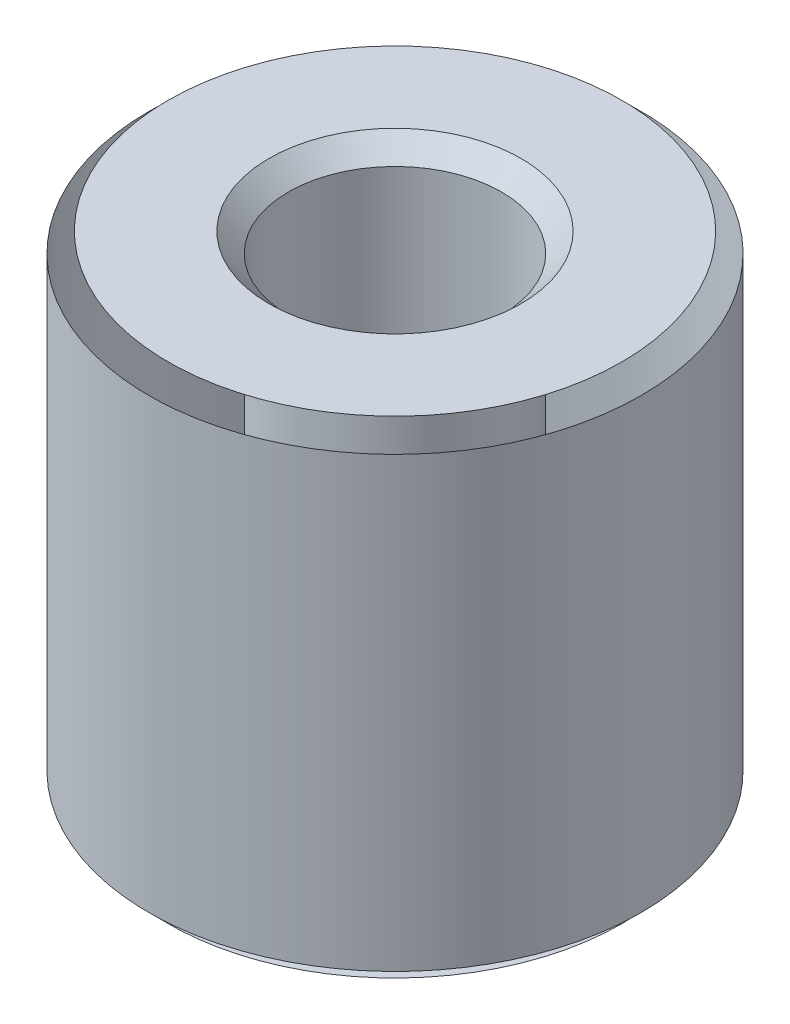
ISO-10303-21;
HEADER;
FILE_DESCRIPTION(('STEP AP214'),'2;1');
FILE_NAME('part.step','',(''),(''),'','','');
FILE_SCHEMA(('AUTOMOTIVE_DESIGN { 1 0 10303 214 1 1 1 1 }'));
ENDSEC;
DATA;
#1=APPLICATION_CONTEXT('core data for automotive mechanical design processes');
#2=APPLICATION_PROTOCOL_DEFINITION('international standard','automotive_design',2000,#1);
#3=PRODUCT_CONTEXT('',#1,'mechanical');
#4=PRODUCT('Part','Part','',(#3));
#5=PRODUCT_RELATED_PRODUCT_CATEGORY('part','',(#4));
#6=PRODUCT_DEFINITION_FORMATION('','',#4);
#7=PRODUCT_DEFINITION_CONTEXT('part definition',#1,'design');
#8=PRODUCT_DEFINITION('design','',#6,#7);
#9=PRODUCT_DEFINITION_SHAPE('','',#8);
#10=(LENGTH_UNIT() NAMED_UNIT(*) SI_UNIT(.MILLI.,.METRE.));
#11=(NAMED_UNIT(*) PLANE_ANGLE_UNIT() SI_UNIT($,.RADIAN.));
#12=(NAMED_UNIT(*) SI_UNIT($,.STERADIAN.) SOLID_ANGLE_UNIT());
#13=UNCERTAINTY_MEASURE_WITH_UNIT(LENGTH_MEASURE(1.E-05),#10,'distance_accuracy_value','');
#14=(GEOMETRIC_REPRESENTATION_CONTEXT(3) GLOBAL_UNCERTAINTY_ASSIGNED_CONTEXT((#13)) GLOBAL_UNIT_ASSIGNED_CONTEXT((#10,
#11,#12)) REPRESENTATION_CONTEXT('',''));
#15=CARTESIAN_POINT('',(0.,0.,0.));
#16=DIRECTION('',(0.,0.,1.));
#17=DIRECTION('',(1.,0.,0.));
#18=AXIS2_PLACEMENT_3D('',#15,#16,#17);
#19=CARTESIAN_POINT('',(19.4709999999783,-0.498499977939196,37.1094));
#20=DIRECTION('',(0.,-1.,0.));
#21=DIRECTION('',(-0.11186091417947,0.,0.99372387305475));
#22=AXIS2_PLACEMENT_3D('',#19,#20,#21);
#23=CONICAL_SURFACE('',#22,6.1,0.785398163397451);
#24=CARTESIAN_POINT('',(19.4709999999783,-0.748499977939197,37.1094));
#25=DIRECTION('',(0.,1.,0.));
#26=DIRECTION('',(-0.11186091417947,0.,0.99372387305475));
#27=AXIS2_PLACEMENT_3D('',#24,#25,#26);
#28=CIRCLE('',#27,6.35);
#29=CARTESIAN_POINT('',(20.1813168050179,-0.748499977939197,30.7992534061022));
#30=VERTEX_POINT('',#29);
#31=CARTESIAN_POINT('',(18.7606831949386,-0.748499977939197,43.4195465938976));
#32=VERTEX_POINT('',#31);
#33=EDGE_CURVE('E120',#30,#32,#28,.T.);
#34=ORIENTED_EDGE('',*,*,#33,.T.);
#35=CARTESIAN_POINT('',(19.4709999999783,-0.748499977939197,37.1094));
#36=DIRECTION('',(0.,1.,0.));
#37=DIRECTION('',(-0.11186091417947,0.,0.99372387305475));
#38=AXIS2_PLACEMENT_3D('',#35,#36,#37);
#39=CIRCLE('',#38,6.35);
#40=EDGE_CURVE('E28',#32,#30,#39,.T.);
#41=ORIENTED_EDGE('',*,*,#40,.T.);
#42=DIRECTION('',(-0.0790976109660302,0.707106781186545,0.702668889263976));
#43=VECTOR('',#42,1.);
#44=CARTESIAN_POINT('',(20.153351576473,-0.498499977939196,31.0476843743659));
#45=LINE('',#44,#43);
#46=CARTESIAN_POINT('',(20.1253863479282,-0.248499977939196,31.2961153426296));
#47=VERTEX_POINT('',#46);
#48=EDGE_CURVE('E11',#30,#47,#45,.T.);
#49=ORIENTED_EDGE('',*,*,#48,.T.);
#50=CARTESIAN_POINT('',(19.4709999999783,-0.248499977939196,37.1094));
#51=DIRECTION('',(0.,-1.,0.));
#52=DIRECTION('',(-0.11186091417947,0.,0.99372387305475));
#53=AXIS2_PLACEMENT_3D('',#50,#51,#52);
#54=CIRCLE('',#53,5.85);
#55=EDGE_CURVE('E129',#47,#47,#54,.T.);
#56=ORIENTED_EDGE('',*,*,#55,.T.);
#57=ORIENTED_EDGE('',*,*,#48,.F.);
#58=EDGE_LOOP('',(#34,#41,#49,#56,#57));
#59=FACE_BOUND('',#58,.T.);
#60=ADVANCED_FACE('F17',(#59),#23,.T.);
#61=CARTESIAN_POINT('',(19.4709999999783,-6.52499999999985,37.1094));
#62=DIRECTION('',(0.,-1.,0.));
#63=DIRECTION('',(0.11186091417947,0.,-0.99372387305475));
#64=AXIS2_PLACEMENT_3D('',#61,#62,#63);
#65=CYLINDRICAL_SURFACE('',#64,6.35);
#66=CARTESIAN_POINT('',(19.4709999999783,-12.3015000220605,37.1094));
#67=DIRECTION('',(0.,-1.,0.));
#68=DIRECTION('',(-0.11186091417947,0.,0.99372387305475));
#69=AXIS2_PLACEMENT_3D('',#66,#67,#68);
#70=CIRCLE('',#69,6.35);
#71=CARTESIAN_POINT('',(20.1813168050179,-12.3015000220605,30.7992534061022));
#72=VERTEX_POINT('',#71);
#73=CARTESIAN_POINT('',(18.7606831949386,-12.3015000220605,43.4195465938976));
#74=VERTEX_POINT('',#73);
#75=EDGE_CURVE('E124',#72,#74,#70,.T.);
#76=ORIENTED_EDGE('',*,*,#75,.F.);
#77=CARTESIAN_POINT('',(19.4709999999783,-12.3015000220605,37.1094));
#78=DIRECTION('',(0.,-1.,0.));
#79=DIRECTION('',(-0.11186091417947,0.,0.99372387305475));
#80=AXIS2_PLACEMENT_3D('',#77,#78,#79);
#81=CIRCLE('',#80,6.35);
#82=EDGE_CURVE('E121',#74,#72,#81,.T.);
#83=ORIENTED_EDGE('',*,*,#82,.F.);
#84=DIRECTION('',(0.,1.,0.));
#85=VECTOR('',#84,1.);
#86=CARTESIAN_POINT('',(18.7606831949386,-6.52499999999985,43.4195465938976));
#87=LINE('',#86,#85);
#88=EDGE_CURVE('E116',#74,#32,#87,.T.);
#89=ORIENTED_EDGE('',*,*,#88,.T.);
#90=ORIENTED_EDGE('',*,*,#33,.F.);
#91=ORIENTED_EDGE('',*,*,#40,.F.);
#92=ORIENTED_EDGE('',*,*,#88,.F.);
#93=EDGE_LOOP('',(#76,#83,#89,#90,#91,#92));
#94=FACE_BOUND('',#93,.T.);
#95=ADVANCED_FACE('F154',(#94),#65,.T.);
#96=CARTESIAN_POINT('',(19.4709999999783,-12.5515000220605,37.1094));
#97=DIRECTION('',(0.,1.,0.));
#98=DIRECTION('',(-0.11186091417947,0.,0.99372387305475));
#99=AXIS2_PLACEMENT_3D('',#96,#97,#98);
#100=CONICAL_SURFACE('',#99,6.1,0.785398163397454);
#101=CARTESIAN_POINT('',(19.4709999999783,-12.8015000220605,37.1094));
#102=DIRECTION('',(0.,1.,0.));
#103=DIRECTION('',(-0.11186091417947,0.,0.99372387305475));
#104=AXIS2_PLACEMENT_3D('',#101,#102,#103);
#105=CIRCLE('',#104,5.85);
#106=CARTESIAN_POINT('',(20.1253863479282,-12.8015000220605,31.2961153426296));
#107=VERTEX_POINT('',#106);
#108=EDGE_CURVE('E99',#107,#107,#105,.T.);
#109=ORIENTED_EDGE('',*,*,#108,.T.);
#110=DIRECTION('',(0.0790976109660304,0.707106781186544,-0.702668889263977));
#111=VECTOR('',#110,1.);
#112=CARTESIAN_POINT('',(20.153351576473,-12.5515000220605,31.0476843743659));
#113=LINE('',#112,#111);
#114=EDGE_CURVE('E74',#107,#72,#113,.T.);
#115=ORIENTED_EDGE('',*,*,#114,.T.);
#116=ORIENTED_EDGE('',*,*,#75,.T.);
#117=ORIENTED_EDGE('',*,*,#82,.T.);
#118=ORIENTED_EDGE('',*,*,#114,.F.);
#119=EDGE_LOOP('',(#109,#115,#116,#117,#118));
#120=FACE_BOUND('',#119,.T.);
#121=ADVANCED_FACE('F158',(#120),#100,.T.);
#122=CARTESIAN_POINT('',(20.1813168050179,-0.248499977939196,30.7992534061022));
#123=DIRECTION('',(0.,1.,0.));
#124=DIRECTION('',(1.,0.,0.));
#125=AXIS2_PLACEMENT_3D('',#122,#123,#124);
#126=PLANE('',#125);
#127=CARTESIAN_POINT('',(19.4709999999783,-0.248499977939196,37.1094));
#128=DIRECTION('',(0.,1.,0.));
#129=DIRECTION('',(0.,0.,-1.));
#130=AXIS2_PLACEMENT_3D('',#127,#128,#129);
#131=CIRCLE('',#130,3.25);
#132=CARTESIAN_POINT('',(19.4709999999783,-0.248499977939196,40.3594));
#133=VERTEX_POINT('',#132);
#134=EDGE_CURVE('E136',#133,#133,#131,.T.);
#135=ORIENTED_EDGE('',*,*,#134,.F.);
#136=EDGE_LOOP('',(#135));
#137=FACE_BOUND('',#136,.T.);
#138=ORIENTED_EDGE('',*,*,#55,.F.);
#139=EDGE_LOOP('',(#138));
#140=FACE_BOUND('',#139,.T.);
#141=ADVANCED_FACE('F213',(#137,#140),#126,.T.);
#142=CARTESIAN_POINT('',(19.4709999999783,-0.498499977939196,37.1094));
#143=DIRECTION('',(0.,1.,0.));
#144=DIRECTION('',(0.,0.,-1.));
#145=AXIS2_PLACEMENT_3D('',#142,#143,#144);
#146=CONICAL_SURFACE('',#145,3.,0.785398163397446);
#147=ORIENTED_EDGE('',*,*,#134,.T.);
#148=DIRECTION('',(0.,-0.707106781186549,-0.707106781186546));
#149=VECTOR('',#148,1.);
#150=CARTESIAN_POINT('',(19.4709999999783,-0.498499977939196,40.1094));
#151=LINE('',#150,#149);
#152=CARTESIAN_POINT('',(19.4709999999783,-0.748499977939197,39.8594));
#153=VERTEX_POINT('',#152);
#154=EDGE_CURVE('E63',#133,#153,#151,.T.);
#155=ORIENTED_EDGE('',*,*,#154,.T.);
#156=CARTESIAN_POINT('',(19.4709999999783,-0.748499977939197,37.1094));
#157=DIRECTION('',(0.,-1.,0.));
#158=DIRECTION('',(0.,0.,-1.));
#159=AXIS2_PLACEMENT_3D('',#156,#157,#158);
#160=CIRCLE('',#159,2.75);
#161=CARTESIAN_POINT('',(19.4709999999783,-0.748499977939197,34.3594));
#162=VERTEX_POINT('',#161);
#163=EDGE_CURVE('E105',#153,#162,#160,.T.);
#164=ORIENTED_EDGE('',*,*,#163,.T.);
#165=CARTESIAN_POINT('',(19.4709999999783,-0.748499977939197,37.1094));
#166=DIRECTION('',(0.,-1.,0.));
#167=DIRECTION('',(0.,0.,-1.));
#168=AXIS2_PLACEMENT_3D('',#165,#166,#167);
#169=CIRCLE('',#168,2.75);
#170=EDGE_CURVE('E96',#162,#153,#169,.T.);
#171=ORIENTED_EDGE('',*,*,#170,.T.);
#172=ORIENTED_EDGE('',*,*,#154,.F.);
#173=EDGE_LOOP('',(#147,#155,#164,#171,#172));
#174=FACE_BOUND('',#173,.T.);
#175=ADVANCED_FACE('F208',(#174),#146,.F.);
#176=CARTESIAN_POINT('',(19.4709999999783,-12.8015000220605,37.1094));
#177=DIRECTION('',(0.,-1.,0.));
#178=DIRECTION('',(0.,0.,-1.));
#179=AXIS2_PLACEMENT_3D('',#176,#177,#178);
#180=PLANE('',#179);
#181=CARTESIAN_POINT('',(19.4709999999783,-12.8015000220605,37.1094));
#182=DIRECTION('',(0.,-1.,0.));
#183=DIRECTION('',(0.,0.,1.));
#184=AXIS2_PLACEMENT_3D('',#181,#182,#183);
#185=CIRCLE('',#184,3.25);
#186=CARTESIAN_POINT('',(19.4709999999783,-12.8015000220605,33.8594));
#187=VERTEX_POINT('',#186);
#188=EDGE_CURVE('E113',#187,#187,#185,.T.);
#189=ORIENTED_EDGE('',*,*,#188,.F.);
#190=EDGE_LOOP('',(#189));
#191=FACE_BOUND('',#190,.T.);
#192=ORIENTED_EDGE('',*,*,#108,.F.);
#193=EDGE_LOOP('',(#192));
#194=FACE_BOUND('',#193,.T.);
#195=ADVANCED_FACE('F19',(#191,#194),#180,.T.);
#196=CARTESIAN_POINT('',(19.4709999999783,-7.15265000220592,37.1094));
#197=DIRECTION('',(0.,-1.,0.));
#198=DIRECTION('',(0.,0.,1.));
#199=AXIS2_PLACEMENT_3D('',#196,#197,#198);
#200=CYLINDRICAL_SURFACE('',#199,2.75);
#201=ORIENTED_EDGE('',*,*,#163,.F.);
#202=ORIENTED_EDGE('',*,*,#170,.F.);
#203=DIRECTION('',(0.,-1.,0.));
#204=VECTOR('',#203,1.);
#205=CARTESIAN_POINT('',(19.4709999999783,-7.15265000220592,34.3594));
#206=LINE('',#205,#204);
#207=CARTESIAN_POINT('',(19.4709999999783,-12.3015000220605,34.3594));
#208=VERTEX_POINT('',#207);
#209=EDGE_CURVE('E85',#162,#208,#206,.T.);
#210=ORIENTED_EDGE('',*,*,#209,.T.);
#211=CARTESIAN_POINT('',(19.4709999999783,-12.3015000220605,37.1094));
#212=DIRECTION('',(0.,1.,0.));
#213=DIRECTION('',(0.,0.,1.));
#214=AXIS2_PLACEMENT_3D('',#211,#212,#213);
#215=CIRCLE('',#214,2.75);
#216=EDGE_CURVE('E94',#208,#208,#215,.T.);
#217=ORIENTED_EDGE('',*,*,#216,.F.);
#218=ORIENTED_EDGE('',*,*,#209,.F.);
#219=EDGE_LOOP('',(#201,#202,#210,#217,#218));
#220=FACE_BOUND('',#219,.T.);
#221=ADVANCED_FACE('F93',(#220),#200,.F.);
#222=CARTESIAN_POINT('',(19.4709999999783,-12.5515000220605,37.1094));
#223=DIRECTION('',(0.,-1.,0.));
#224=DIRECTION('',(0.,0.,1.));
#225=AXIS2_PLACEMENT_3D('',#222,#223,#224);
#226=CONICAL_SURFACE('',#225,3.,0.785398163397451);
#227=ORIENTED_EDGE('',*,*,#188,.T.);
#228=DIRECTION('',(0.,0.707106781186546,0.707106781186549));
#229=VECTOR('',#228,1.);
#230=CARTESIAN_POINT('',(19.4709999999783,-12.5515000220605,34.1094));
#231=LINE('',#230,#229);
#232=EDGE_CURVE('E21',#187,#208,#231,.T.);
#233=ORIENTED_EDGE('',*,*,#232,.T.);
#234=ORIENTED_EDGE('',*,*,#216,.T.);
#235=ORIENTED_EDGE('',*,*,#232,.F.);
#236=EDGE_LOOP('',(#227,#233,#234,#235));
#237=FACE_BOUND('',#236,.T.);
#238=ADVANCED_FACE('F103',(#237),#226,.F.);
#239=CLOSED_SHELL('',(#60,#95,#121,#141,#175,#195,#221,#238));
#240=MANIFOLD_SOLID_BREP('B1',#239);
#241=ADVANCED_BREP_SHAPE_REPRESENTATION('',(#18,#240),#14);
#242=SHAPE_DEFINITION_REPRESENTATION(#9,#241);
ENDSEC;
END-ISO-10303-21;
